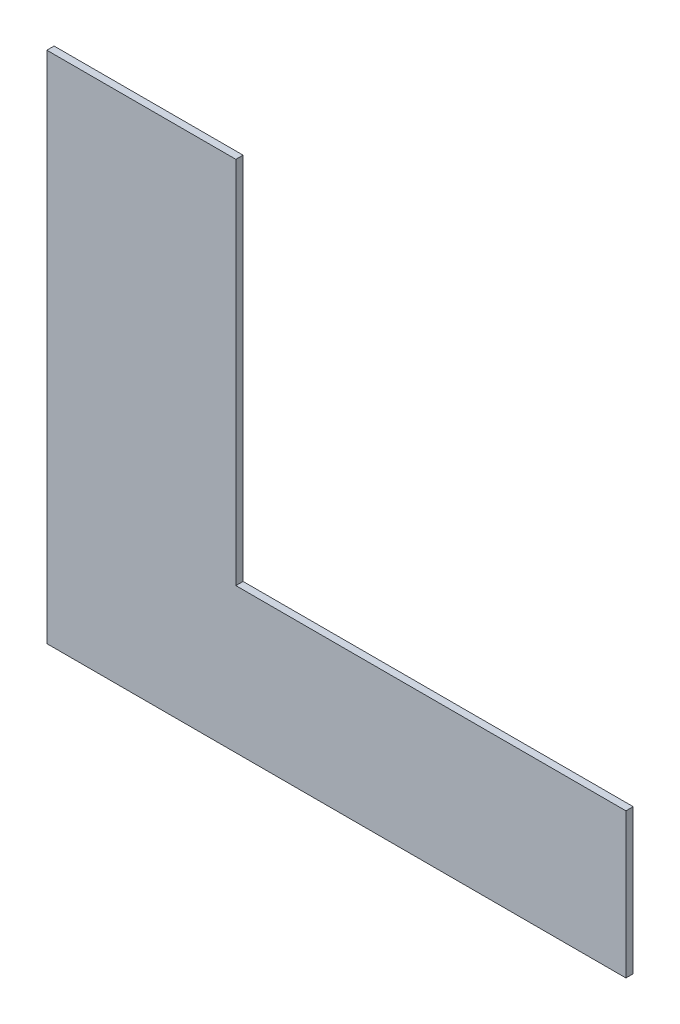
ISO-10303-21;
HEADER;
FILE_DESCRIPTION(('STEP AP214'),'2;1');
FILE_NAME('part.step','',(''),(''),'','','');
FILE_SCHEMA(('AUTOMOTIVE_DESIGN { 1 0 10303 214 1 1 1 1 }'));
ENDSEC;
DATA;
#1=APPLICATION_CONTEXT('core data for automotive mechanical design processes');
#2=APPLICATION_PROTOCOL_DEFINITION('international standard','automotive_design',2000,#1);
#3=PRODUCT_CONTEXT('',#1,'mechanical');
#4=PRODUCT('Part','Part','',(#3));
#5=PRODUCT_RELATED_PRODUCT_CATEGORY('part','',(#4));
#6=PRODUCT_DEFINITION_FORMATION('','',#4);
#7=PRODUCT_DEFINITION_CONTEXT('part definition',#1,'design');
#8=PRODUCT_DEFINITION('design','',#6,#7);
#9=PRODUCT_DEFINITION_SHAPE('','',#8);
#10=(LENGTH_UNIT() NAMED_UNIT(*) SI_UNIT(.MILLI.,.METRE.));
#11=(NAMED_UNIT(*) PLANE_ANGLE_UNIT() SI_UNIT($,.RADIAN.));
#12=(NAMED_UNIT(*) SI_UNIT($,.STERADIAN.) SOLID_ANGLE_UNIT());
#13=UNCERTAINTY_MEASURE_WITH_UNIT(LENGTH_MEASURE(1.E-05),#10,'distance_accuracy_value','');
#14=(GEOMETRIC_REPRESENTATION_CONTEXT(3) GLOBAL_UNCERTAINTY_ASSIGNED_CONTEXT((#13)) GLOBAL_UNIT_ASSIGNED_CONTEXT((#10,
#11,#12)) REPRESENTATION_CONTEXT('',''));
#15=CARTESIAN_POINT('',(0.,0.,0.));
#16=DIRECTION('',(0.,0.,1.));
#17=DIRECTION('',(1.,0.,0.));
#18=AXIS2_PLACEMENT_3D('',#15,#16,#17);
#19=CARTESIAN_POINT('',(-198.955968468469,177.126470588228,5.));
#20=DIRECTION('',(0.,-1.,0.));
#21=DIRECTION('',(0.,0.,-1.));
#22=AXIS2_PLACEMENT_3D('',#19,#20,#21);
#23=PLANE('',#22);
#24=DIRECTION('',(-1.,0.,0.));
#25=VECTOR('',#24,1.);
#26=CARTESIAN_POINT('',(-198.955968468469,177.126470588228,0.));
#27=LINE('',#26,#25);
#28=CARTESIAN_POINT('',(-68.3859684684687,177.126470588228,0.));
#29=VERTEX_POINT('',#28);
#30=CARTESIAN_POINT('',(-198.955968468469,177.126470588228,0.));
#31=VERTEX_POINT('',#30);
#32=EDGE_CURVE('E122',#29,#31,#27,.T.);
#33=ORIENTED_EDGE('',*,*,#32,.T.);
#34=DIRECTION('',(0.,0.,-1.));
#35=VECTOR('',#34,1.);
#36=CARTESIAN_POINT('',(-198.955968468469,177.126470588228,5.));
#37=LINE('',#36,#35);
#38=CARTESIAN_POINT('',(-198.955968468469,177.126470588228,5.));
#39=VERTEX_POINT('',#38);
#40=EDGE_CURVE('E11',#39,#31,#37,.T.);
#41=ORIENTED_EDGE('',*,*,#40,.F.);
#42=DIRECTION('',(-1.,0.,0.));
#43=VECTOR('',#42,1.);
#44=CARTESIAN_POINT('',(-198.955968468469,177.126470588228,5.));
#45=LINE('',#44,#43);
#46=CARTESIAN_POINT('',(-68.3859684684687,177.126470588228,5.));
#47=VERTEX_POINT('',#46);
#48=EDGE_CURVE('E132',#47,#39,#45,.T.);
#49=ORIENTED_EDGE('',*,*,#48,.F.);
#50=DIRECTION('',(0.,0.,-1.));
#51=VECTOR('',#50,1.);
#52=CARTESIAN_POINT('',(-68.3859684684687,177.126470588228,5.));
#53=LINE('',#52,#51);
#54=EDGE_CURVE('E118',#47,#29,#53,.T.);
#55=ORIENTED_EDGE('',*,*,#54,.T.);
#56=EDGE_LOOP('',(#33,#41,#49,#55));
#57=FACE_BOUND('',#56,.T.);
#58=ADVANCED_FACE('F38',(#57),#23,.F.);
#59=CARTESIAN_POINT('',(-198.955968468469,177.126470588228,5.));
#60=DIRECTION('',(1.,0.,0.));
#61=DIRECTION('',(0.,0.,-1.));
#62=AXIS2_PLACEMENT_3D('',#59,#60,#61);
#63=PLANE('',#62);
#64=DIRECTION('',(0.,-1.,0.));
#65=VECTOR('',#64,1.);
#66=CARTESIAN_POINT('',(-198.955968468469,177.126470588228,0.));
#67=LINE('',#66,#65);
#68=CARTESIAN_POINT('',(-198.955968468469,-177.873529411772,0.));
#69=VERTEX_POINT('',#68);
#70=EDGE_CURVE('E125',#31,#69,#67,.T.);
#71=ORIENTED_EDGE('',*,*,#70,.T.);
#72=DIRECTION('',(0.,0.,-1.));
#73=VECTOR('',#72,1.);
#74=CARTESIAN_POINT('',(-198.955968468469,-177.873529411772,5.));
#75=LINE('',#74,#73);
#76=CARTESIAN_POINT('',(-198.955968468469,-177.873529411772,5.));
#77=VERTEX_POINT('',#76);
#78=EDGE_CURVE('E46',#77,#69,#75,.T.);
#79=ORIENTED_EDGE('',*,*,#78,.F.);
#80=DIRECTION('',(0.,-1.,0.));
#81=VECTOR('',#80,1.);
#82=CARTESIAN_POINT('',(-198.955968468469,177.126470588228,5.));
#83=LINE('',#82,#81);
#84=EDGE_CURVE('E91',#39,#77,#83,.T.);
#85=ORIENTED_EDGE('',*,*,#84,.F.);
#86=ORIENTED_EDGE('',*,*,#40,.T.);
#87=EDGE_LOOP('',(#71,#79,#85,#86));
#88=FACE_BOUND('',#87,.T.);
#89=ADVANCED_FACE('F156',(#88),#63,.F.);
#90=CARTESIAN_POINT('',(-198.955968468469,-177.873529411772,5.));
#91=DIRECTION('',(0.,1.,0.));
#92=DIRECTION('',(0.,0.,1.));
#93=AXIS2_PLACEMENT_3D('',#90,#91,#92);
#94=PLANE('',#93);
#95=DIRECTION('',(1.,0.,0.));
#96=VECTOR('',#95,1.);
#97=CARTESIAN_POINT('',(-198.955968468469,-177.873529411772,0.));
#98=LINE('',#97,#96);
#99=CARTESIAN_POINT('',(201.044031531531,-177.873529411772,0.));
#100=VERTEX_POINT('',#99);
#101=EDGE_CURVE('E127',#69,#100,#98,.T.);
#102=ORIENTED_EDGE('',*,*,#101,.T.);
#103=DIRECTION('',(0.,0.,-1.));
#104=VECTOR('',#103,1.);
#105=CARTESIAN_POINT('',(201.044031531531,-177.873529411772,5.));
#106=LINE('',#105,#104);
#107=CARTESIAN_POINT('',(201.044031531531,-177.873529411772,5.));
#108=VERTEX_POINT('',#107);
#109=EDGE_CURVE('E113',#108,#100,#106,.T.);
#110=ORIENTED_EDGE('',*,*,#109,.F.);
#111=DIRECTION('',(1.,0.,0.));
#112=VECTOR('',#111,1.);
#113=CARTESIAN_POINT('',(-198.955968468469,-177.873529411772,5.));
#114=LINE('',#113,#112);
#115=EDGE_CURVE('E104',#77,#108,#114,.T.);
#116=ORIENTED_EDGE('',*,*,#115,.F.);
#117=ORIENTED_EDGE('',*,*,#78,.T.);
#118=EDGE_LOOP('',(#102,#110,#116,#117));
#119=FACE_BOUND('',#118,.T.);
#120=ADVANCED_FACE('F138',(#119),#94,.F.);
#121=CARTESIAN_POINT('',(201.044031531531,-177.873529411772,5.));
#122=DIRECTION('',(-1.,0.,0.));
#123=DIRECTION('',(0.,0.,1.));
#124=AXIS2_PLACEMENT_3D('',#121,#122,#123);
#125=PLANE('',#124);
#126=DIRECTION('',(0.,1.,0.));
#127=VECTOR('',#126,1.);
#128=CARTESIAN_POINT('',(201.044031531531,-177.873529411772,0.));
#129=LINE('',#128,#127);
#130=CARTESIAN_POINT('',(201.044031531531,-77.8735294117856,0.));
#131=VERTEX_POINT('',#130);
#132=EDGE_CURVE('E112',#100,#131,#129,.T.);
#133=ORIENTED_EDGE('',*,*,#132,.T.);
#134=DIRECTION('',(0.,0.,-1.));
#135=VECTOR('',#134,1.);
#136=CARTESIAN_POINT('',(201.044031531531,-77.8735294117856,5.));
#137=LINE('',#136,#135);
#138=CARTESIAN_POINT('',(201.044031531531,-77.8735294117856,5.));
#139=VERTEX_POINT('',#138);
#140=EDGE_CURVE('E109',#139,#131,#137,.T.);
#141=ORIENTED_EDGE('',*,*,#140,.F.);
#142=DIRECTION('',(0.,1.,0.));
#143=VECTOR('',#142,1.);
#144=CARTESIAN_POINT('',(201.044031531531,-177.873529411772,5.));
#145=LINE('',#144,#143);
#146=EDGE_CURVE('E98',#108,#139,#145,.T.);
#147=ORIENTED_EDGE('',*,*,#146,.F.);
#148=ORIENTED_EDGE('',*,*,#109,.T.);
#149=EDGE_LOOP('',(#133,#141,#147,#148));
#150=FACE_BOUND('',#149,.T.);
#151=ADVANCED_FACE('F110',(#150),#125,.F.);
#152=CARTESIAN_POINT('',(201.044031531531,-77.8735294117856,5.));
#153=DIRECTION('',(0.,-1.,0.));
#154=DIRECTION('',(1.,0.,0.));
#155=AXIS2_PLACEMENT_3D('',#152,#153,#154);
#156=PLANE('',#155);
#157=DIRECTION('',(-1.,0.,0.));
#158=VECTOR('',#157,1.);
#159=CARTESIAN_POINT('',(201.044031531531,-77.8735294117856,0.));
#160=LINE('',#159,#158);
#161=CARTESIAN_POINT('',(-68.3859684684687,-77.8735294117856,0.));
#162=VERTEX_POINT('',#161);
#163=EDGE_CURVE('E77',#131,#162,#160,.T.);
#164=ORIENTED_EDGE('',*,*,#163,.T.);
#165=DIRECTION('',(0.,0.,-1.));
#166=VECTOR('',#165,1.);
#167=CARTESIAN_POINT('',(-68.3859684684687,-77.8735294117856,5.));
#168=LINE('',#167,#166);
#169=CARTESIAN_POINT('',(-68.3859684684687,-77.8735294117856,5.));
#170=VERTEX_POINT('',#169);
#171=EDGE_CURVE('E114',#170,#162,#168,.T.);
#172=ORIENTED_EDGE('',*,*,#171,.F.);
#173=DIRECTION('',(-1.,0.,0.));
#174=VECTOR('',#173,1.);
#175=CARTESIAN_POINT('',(201.044031531531,-77.8735294117856,5.));
#176=LINE('',#175,#174);
#177=EDGE_CURVE('E102',#139,#170,#176,.T.);
#178=ORIENTED_EDGE('',*,*,#177,.F.);
#179=ORIENTED_EDGE('',*,*,#140,.T.);
#180=EDGE_LOOP('',(#164,#172,#178,#179));
#181=FACE_BOUND('',#180,.T.);
#182=ADVANCED_FACE('F116',(#181),#156,.F.);
#183=CARTESIAN_POINT('',(-68.3859684684687,-77.8735294117856,5.));
#184=DIRECTION('',(-1.,0.,0.));
#185=DIRECTION('',(0.,0.,1.));
#186=AXIS2_PLACEMENT_3D('',#183,#184,#185);
#187=PLANE('',#186);
#188=DIRECTION('',(0.,1.,0.));
#189=VECTOR('',#188,1.);
#190=CARTESIAN_POINT('',(-68.3859684684687,-77.8735294117856,0.));
#191=LINE('',#190,#189);
#192=EDGE_CURVE('E83',#162,#29,#191,.T.);
#193=ORIENTED_EDGE('',*,*,#192,.T.);
#194=ORIENTED_EDGE('',*,*,#54,.F.);
#195=DIRECTION('',(0.,1.,0.));
#196=VECTOR('',#195,1.);
#197=CARTESIAN_POINT('',(-68.3859684684687,-77.8735294117856,5.));
#198=LINE('',#197,#196);
#199=EDGE_CURVE('E54',#170,#47,#198,.T.);
#200=ORIENTED_EDGE('',*,*,#199,.F.);
#201=ORIENTED_EDGE('',*,*,#171,.T.);
#202=EDGE_LOOP('',(#193,#194,#200,#201));
#203=FACE_BOUND('',#202,.T.);
#204=ADVANCED_FACE('F145',(#203),#187,.F.);
#205=CARTESIAN_POINT('',(0.,0.,5.));
#206=DIRECTION('',(0.,0.,1.));
#207=DIRECTION('',(1.,0.,0.));
#208=AXIS2_PLACEMENT_3D('',#205,#206,#207);
#209=PLANE('',#208);
#210=ORIENTED_EDGE('',*,*,#48,.T.);
#211=ORIENTED_EDGE('',*,*,#84,.T.);
#212=ORIENTED_EDGE('',*,*,#115,.T.);
#213=ORIENTED_EDGE('',*,*,#146,.T.);
#214=ORIENTED_EDGE('',*,*,#177,.T.);
#215=ORIENTED_EDGE('',*,*,#199,.T.);
#216=EDGE_LOOP('',(#210,#211,#212,#213,#214,#215));
#217=FACE_BOUND('',#216,.T.);
#218=ADVANCED_FACE('F100',(#217),#209,.T.);
#219=CARTESIAN_POINT('',(0.,0.,0.));
#220=DIRECTION('',(0.,0.,1.));
#221=DIRECTION('',(1.,0.,0.));
#222=AXIS2_PLACEMENT_3D('',#219,#220,#221);
#223=PLANE('',#222);
#224=ORIENTED_EDGE('',*,*,#32,.F.);
#225=ORIENTED_EDGE('',*,*,#192,.F.);
#226=ORIENTED_EDGE('',*,*,#163,.F.);
#227=ORIENTED_EDGE('',*,*,#132,.F.);
#228=ORIENTED_EDGE('',*,*,#101,.F.);
#229=ORIENTED_EDGE('',*,*,#70,.F.);
#230=EDGE_LOOP('',(#224,#225,#226,#227,#228,#229));
#231=FACE_BOUND('',#230,.T.);
#232=ADVANCED_FACE('F141',(#231),#223,.F.);
#233=CLOSED_SHELL('',(#58,#89,#120,#151,#182,#204,#218,#232));
#234=MANIFOLD_SOLID_BREP('B2',#233);
#235=ADVANCED_BREP_SHAPE_REPRESENTATION('',(#18,#234),#14);
#236=SHAPE_DEFINITION_REPRESENTATION(#9,#235);
ENDSEC;
END-ISO-10303-21;
